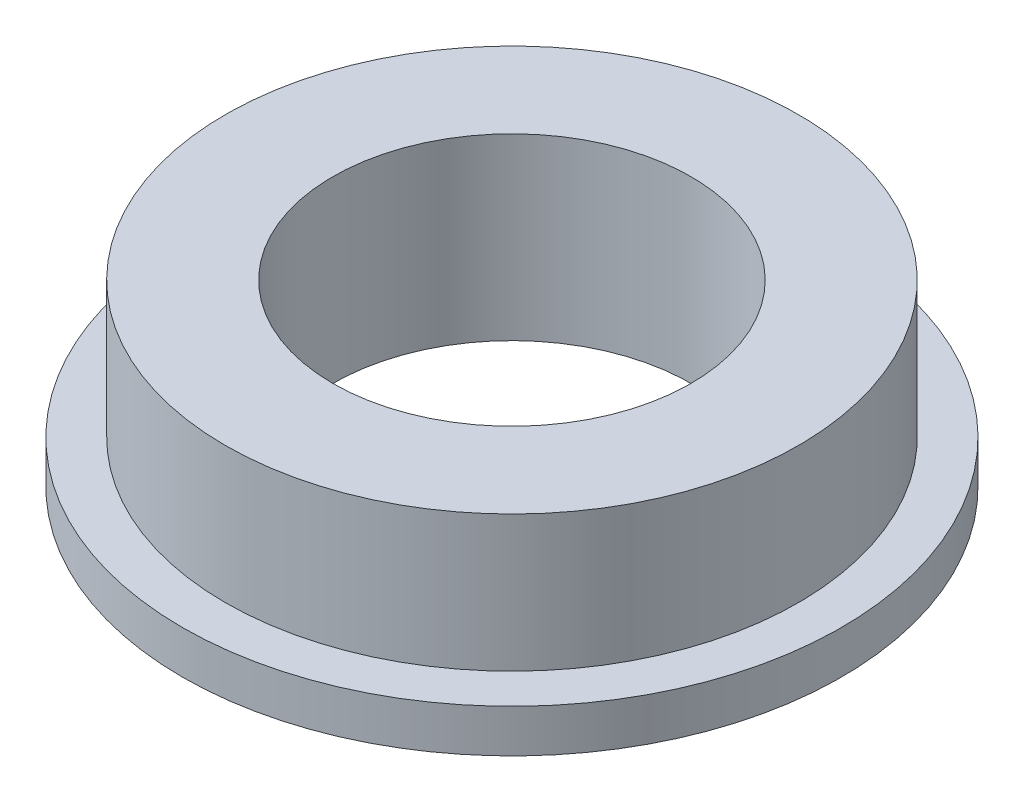
ISO-10303-21;
HEADER;
FILE_DESCRIPTION(('STEP AP214'),'2;1');
FILE_NAME('part.step','',(''),(''),'','','');
FILE_SCHEMA(('AUTOMOTIVE_DESIGN { 1 0 10303 214 1 1 1 1 }'));
ENDSEC;
DATA;
#1=APPLICATION_CONTEXT('core data for automotive mechanical design processes');
#2=APPLICATION_PROTOCOL_DEFINITION('international standard','automotive_design',2000,#1);
#3=PRODUCT_CONTEXT('',#1,'mechanical');
#4=PRODUCT('Part','Part','',(#3));
#5=PRODUCT_RELATED_PRODUCT_CATEGORY('part','',(#4));
#6=PRODUCT_DEFINITION_FORMATION('','',#4);
#7=PRODUCT_DEFINITION_CONTEXT('part definition',#1,'design');
#8=PRODUCT_DEFINITION('design','',#6,#7);
#9=PRODUCT_DEFINITION_SHAPE('','',#8);
#10=(LENGTH_UNIT() NAMED_UNIT(*) SI_UNIT(.MILLI.,.METRE.));
#11=(NAMED_UNIT(*) PLANE_ANGLE_UNIT() SI_UNIT($,.RADIAN.));
#12=(NAMED_UNIT(*) SI_UNIT($,.STERADIAN.) SOLID_ANGLE_UNIT());
#13=UNCERTAINTY_MEASURE_WITH_UNIT(LENGTH_MEASURE(1.E-05),#10,'distance_accuracy_value','');
#14=(GEOMETRIC_REPRESENTATION_CONTEXT(3) GLOBAL_UNCERTAINTY_ASSIGNED_CONTEXT((#13)) GLOBAL_UNIT_ASSIGNED_CONTEXT((#10,
#11,#12)) REPRESENTATION_CONTEXT('',''));
#15=CARTESIAN_POINT('',(0.,0.,0.));
#16=DIRECTION('',(0.,0.,1.));
#17=DIRECTION('',(1.,0.,0.));
#18=AXIS2_PLACEMENT_3D('',#15,#16,#17);
#19=CARTESIAN_POINT('',(0.,2.5,0.));
#20=DIRECTION('',(0.,1.,0.));
#21=DIRECTION('',(0.,0.,1.));
#22=AXIS2_PLACEMENT_3D('',#19,#20,#21);
#23=PLANE('',#22);
#24=CARTESIAN_POINT('',(0.,2.5,0.));
#25=DIRECTION('',(0.,1.,0.));
#26=DIRECTION('',(0.,0.,1.));
#27=AXIS2_PLACEMENT_3D('',#24,#25,#26);
#28=CIRCLE('',#27,4.);
#29=CARTESIAN_POINT('',(0.,2.5,4.));
#30=VERTEX_POINT('',#29);
#31=EDGE_CURVE('E10',#30,#30,#28,.T.);
#32=ORIENTED_EDGE('',*,*,#31,.T.);
#33=EDGE_LOOP('',(#32));
#34=FACE_BOUND('',#33,.T.);
#35=CARTESIAN_POINT('',(0.,2.5,0.));
#36=DIRECTION('',(0.,1.,0.));
#37=DIRECTION('',(0.,0.,1.));
#38=AXIS2_PLACEMENT_3D('',#35,#36,#37);
#39=CIRCLE('',#38,2.5);
#40=CARTESIAN_POINT('',(0.,2.5,2.5));
#41=VERTEX_POINT('',#40);
#42=EDGE_CURVE('E44',#41,#41,#39,.T.);
#43=ORIENTED_EDGE('',*,*,#42,.F.);
#44=EDGE_LOOP('',(#43));
#45=FACE_BOUND('',#44,.T.);
#46=ADVANCED_FACE('F37',(#34,#45),#23,.T.);
#47=CARTESIAN_POINT('',(0.,0.,0.));
#48=DIRECTION('',(0.,1.,0.));
#49=DIRECTION('',(0.,0.,1.));
#50=AXIS2_PLACEMENT_3D('',#47,#48,#49);
#51=PLANE('',#50);
#52=CARTESIAN_POINT('',(0.,0.,0.));
#53=DIRECTION('',(0.,1.,0.));
#54=DIRECTION('',(0.,0.,1.));
#55=AXIS2_PLACEMENT_3D('',#52,#53,#54);
#56=CIRCLE('',#55,2.5);
#57=CARTESIAN_POINT('',(0.,0.,2.5));
#58=VERTEX_POINT('',#57);
#59=EDGE_CURVE('E48',#58,#58,#56,.T.);
#60=ORIENTED_EDGE('',*,*,#59,.T.);
#61=EDGE_LOOP('',(#60));
#62=FACE_BOUND('',#61,.T.);
#63=CARTESIAN_POINT('',(0.,0.,0.));
#64=DIRECTION('',(0.,1.,0.));
#65=DIRECTION('',(0.,0.,1.));
#66=AXIS2_PLACEMENT_3D('',#63,#64,#65);
#67=CIRCLE('',#66,4.6);
#68=CARTESIAN_POINT('',(0.,0.,4.6));
#69=VERTEX_POINT('',#68);
#70=EDGE_CURVE('E55',#69,#69,#67,.T.);
#71=ORIENTED_EDGE('',*,*,#70,.F.);
#72=EDGE_LOOP('',(#71));
#73=FACE_BOUND('',#72,.T.);
#74=ADVANCED_FACE('F81',(#62,#73),#51,.F.);
#75=CARTESIAN_POINT('',(0.,2.5,0.));
#76=DIRECTION('',(0.,-1.,0.));
#77=DIRECTION('',(0.,0.,-1.));
#78=AXIS2_PLACEMENT_3D('',#75,#76,#77);
#79=CYLINDRICAL_SURFACE('',#78,4.);
#80=CARTESIAN_POINT('',(0.,0.6,0.));
#81=DIRECTION('',(0.,1.,0.));
#82=DIRECTION('',(0.,0.,1.));
#83=AXIS2_PLACEMENT_3D('',#80,#81,#82);
#84=CIRCLE('',#83,4.);
#85=CARTESIAN_POINT('',(0.,0.6,4.));
#86=VERTEX_POINT('',#85);
#87=EDGE_CURVE('E58',#86,#86,#84,.T.);
#88=ORIENTED_EDGE('',*,*,#87,.T.);
#89=EDGE_LOOP('',(#88));
#90=FACE_BOUND('',#89,.T.);
#91=ORIENTED_EDGE('',*,*,#31,.F.);
#92=EDGE_LOOP('',(#91));
#93=FACE_BOUND('',#92,.T.);
#94=ADVANCED_FACE('F39',(#90,#93),#79,.T.);
#95=CARTESIAN_POINT('',(0.,2.5,0.));
#96=DIRECTION('',(0.,-1.,0.));
#97=DIRECTION('',(0.,0.,-1.));
#98=AXIS2_PLACEMENT_3D('',#95,#96,#97);
#99=CYLINDRICAL_SURFACE('',#98,2.5);
#100=ORIENTED_EDGE('',*,*,#42,.T.);
#101=EDGE_LOOP('',(#100));
#102=FACE_BOUND('',#101,.T.);
#103=ORIENTED_EDGE('',*,*,#59,.F.);
#104=EDGE_LOOP('',(#103));
#105=FACE_BOUND('',#104,.T.);
#106=ADVANCED_FACE('F69',(#102,#105),#99,.F.);
#107=CARTESIAN_POINT('',(0.,0.6,0.));
#108=DIRECTION('',(0.,1.,0.));
#109=DIRECTION('',(0.,0.,1.));
#110=AXIS2_PLACEMENT_3D('',#107,#108,#109);
#111=PLANE('',#110);
#112=CARTESIAN_POINT('',(0.,0.6,0.));
#113=DIRECTION('',(0.,1.,0.));
#114=DIRECTION('',(0.,0.,1.));
#115=AXIS2_PLACEMENT_3D('',#112,#113,#114);
#116=CIRCLE('',#115,4.6);
#117=CARTESIAN_POINT('',(0.,0.6,4.6));
#118=VERTEX_POINT('',#117);
#119=EDGE_CURVE('E53',#118,#118,#116,.T.);
#120=ORIENTED_EDGE('',*,*,#119,.T.);
#121=EDGE_LOOP('',(#120));
#122=FACE_BOUND('',#121,.T.);
#123=ORIENTED_EDGE('',*,*,#87,.F.);
#124=EDGE_LOOP('',(#123));
#125=FACE_BOUND('',#124,.T.);
#126=ADVANCED_FACE('F66',(#122,#125),#111,.T.);
#127=CARTESIAN_POINT('',(0.,0.6,0.));
#128=DIRECTION('',(0.,-1.,0.));
#129=DIRECTION('',(0.,0.,-1.));
#130=AXIS2_PLACEMENT_3D('',#127,#128,#129);
#131=CYLINDRICAL_SURFACE('',#130,4.6);
#132=ORIENTED_EDGE('',*,*,#119,.F.);
#133=EDGE_LOOP('',(#132));
#134=FACE_BOUND('',#133,.T.);
#135=ORIENTED_EDGE('',*,*,#70,.T.);
#136=EDGE_LOOP('',(#135));
#137=FACE_BOUND('',#136,.T.);
#138=ADVANCED_FACE('F68',(#134,#137),#131,.T.);
#139=CLOSED_SHELL('',(#46,#74,#94,#106,#126,#138));
#140=MANIFOLD_SOLID_BREP('B2',#139);
#141=ADVANCED_BREP_SHAPE_REPRESENTATION('',(#18,#140),#14);
#142=SHAPE_DEFINITION_REPRESENTATION(#9,#141);
ENDSEC;
END-ISO-10303-21;
